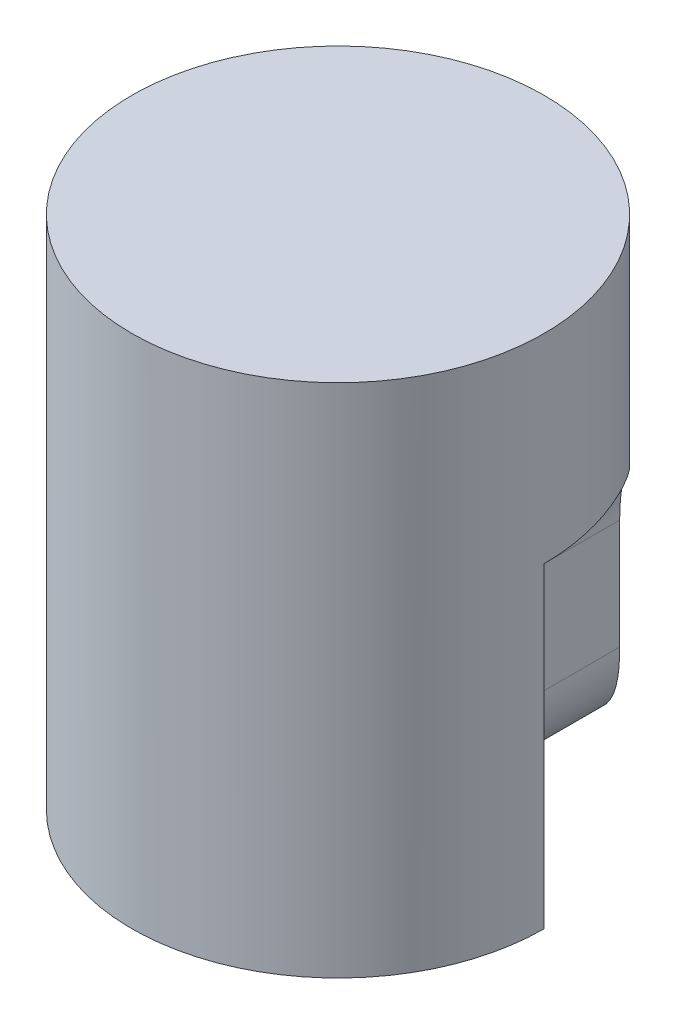
ISO-10303-21;
HEADER;
FILE_DESCRIPTION(('STEP AP214'),'2;1');
FILE_NAME('part.step','',(''),(''),'','','');
FILE_SCHEMA(('AUTOMOTIVE_DESIGN { 1 0 10303 214 1 1 1 1 }'));
ENDSEC;
DATA;
#1=APPLICATION_CONTEXT('core data for automotive mechanical design processes');
#2=APPLICATION_PROTOCOL_DEFINITION('international standard','automotive_design',2000,#1);
#3=PRODUCT_CONTEXT('',#1,'mechanical');
#4=PRODUCT('Part','Part','',(#3));
#5=PRODUCT_RELATED_PRODUCT_CATEGORY('part','',(#4));
#6=PRODUCT_DEFINITION_FORMATION('','',#4);
#7=PRODUCT_DEFINITION_CONTEXT('part definition',#1,'design');
#8=PRODUCT_DEFINITION('design','',#6,#7);
#9=PRODUCT_DEFINITION_SHAPE('','',#8);
#10=(LENGTH_UNIT() NAMED_UNIT(*) SI_UNIT(.MILLI.,.METRE.));
#11=(NAMED_UNIT(*) PLANE_ANGLE_UNIT() SI_UNIT($,.RADIAN.));
#12=(NAMED_UNIT(*) SI_UNIT($,.STERADIAN.) SOLID_ANGLE_UNIT());
#13=UNCERTAINTY_MEASURE_WITH_UNIT(LENGTH_MEASURE(1.E-05),#10,'distance_accuracy_value','');
#14=(GEOMETRIC_REPRESENTATION_CONTEXT(3) GLOBAL_UNCERTAINTY_ASSIGNED_CONTEXT((#13)) GLOBAL_UNIT_ASSIGNED_CONTEXT((#10,
#11,#12)) REPRESENTATION_CONTEXT('',''));
#15=CARTESIAN_POINT('',(0.,0.,0.));
#16=DIRECTION('',(0.,0.,1.));
#17=DIRECTION('',(1.,0.,0.));
#18=AXIS2_PLACEMENT_3D('',#15,#16,#17);
#19=CARTESIAN_POINT('',(-19.05,19.685,-19.05));
#20=DIRECTION('',(0.,0.,1.));
#21=DIRECTION('',(1.,0.,0.));
#22=AXIS2_PLACEMENT_3D('',#19,#20,#21);
#23=CYLINDRICAL_SURFACE('',#22,9.525);
#24=CARTESIAN_POINT('',(-9.525,19.685,-16.4977839420936));
#25=CARTESIAN_POINT('',(-9.52496088221768,19.9183489225181,-16.4977688060201));
#26=CARTESIAN_POINT('',(-9.53357343537535,20.1516940752239,-16.4928328837783));
#27=CARTESIAN_POINT('',(-9.56782098455367,20.6166928659615,-16.4730090010301));
#28=CARTESIAN_POINT('',(-9.59345495367734,20.8483466051835,-16.4581216408907));
#29=CARTESIAN_POINT('',(-9.66141827916372,21.3079945595453,-16.4183115148276));
#30=CARTESIAN_POINT('',(-9.70372489570546,21.5359933207643,-16.3934024165871));
#31=CARTESIAN_POINT('',(-9.80447603838081,21.9870185373,-16.3333465257956));
#32=CARTESIAN_POINT('',(-9.86292032641455,22.2100450659259,-16.2981998842917));
#33=CARTESIAN_POINT('',(-9.99521610639255,22.6496647273588,-16.2174027920262));
#34=CARTESIAN_POINT('',(-10.0690759660033,22.8662542928987,-16.1717466352449));
#35=CARTESIAN_POINT('',(-10.2311844392112,23.2913646090355,-16.0696774570777));
#36=CARTESIAN_POINT('',(-10.3194332274116,23.4998852616819,-16.0132643051592));
#37=CARTESIAN_POINT('',(-10.5090614848233,23.907378271473,-15.889459842336));
#38=CARTESIAN_POINT('',(-10.610436090431,24.1063541280786,-15.8220725953698));
#39=CARTESIAN_POINT('',(-10.8249112557721,24.4935890964673,-15.6761159898764));
#40=CARTESIAN_POINT('',(-10.9380117932454,24.6818482285936,-15.5975466525768));
#41=CARTESIAN_POINT('',(-11.1750045786399,25.0476332269237,-15.428644017613));
#42=CARTESIAN_POINT('',(-11.2989547084654,25.225091737611,-15.3382461680053));
#43=CARTESIAN_POINT('',(-11.5553100388477,25.5672572592252,-15.146054428585));
#44=CARTESIAN_POINT('',(-11.6877152197723,25.7319642997583,-15.0442605652328));
#45=CARTESIAN_POINT('',(-11.959148929316,26.0480866299765,-14.8294036879515));
#46=CARTESIAN_POINT('',(-12.0981788316448,26.1994991442271,-14.7163383313975));
#47=CARTESIAN_POINT('',(-12.3809673411905,26.4887154893166,-14.4792332961164));
#48=CARTESIAN_POINT('',(-12.5247264570661,26.6265178498703,-14.3551924344594));
#49=CARTESIAN_POINT('',(-12.8240837443095,26.8965667697806,-14.08857600897));
#50=CARTESIAN_POINT('',(-12.9798652873072,27.0279466150489,-13.9453291609657));
#51=CARTESIAN_POINT('',(-13.292596777246,27.2756345492098,-13.6475637114415));
#52=CARTESIAN_POINT('',(-13.4495467455553,27.3919423617454,-13.4930449033231));
#53=CARTESIAN_POINT('',(-13.762754527445,27.6100925803929,-13.1734257935092));
#54=CARTESIAN_POINT('',(-13.9190122351257,27.7119328426242,-13.0083239288083));
#55=CARTESIAN_POINT('',(-14.2291689687109,27.9019522424798,-12.6683171080798));
#56=CARTESIAN_POINT('',(-14.3830675205959,27.9901286662581,-12.4934102139944));
#57=CARTESIAN_POINT('',(-14.7634019767403,28.1948738825906,-12.0444610740112));
#58=CARTESIAN_POINT('',(-14.9874622880082,28.3034702163249,-11.7647359891822));
#59=CARTESIAN_POINT('',(-15.4231140025516,28.4956795942884,-11.1875373147456));
#60=CARTESIAN_POINT('',(-15.6347002190687,28.5792823041117,-10.8900564442661));
#61=CARTESIAN_POINT('',(-16.0430181059987,28.7255106526052,-10.2790758596334));
#62=CARTESIAN_POINT('',(-16.2397117705415,28.7880839352012,-9.96553837162547));
#63=CARTESIAN_POINT('',(-16.6156059306471,28.8957307298342,-9.32534286156705));
#64=CARTESIAN_POINT('',(-16.7948065222032,28.9408043379049,-8.99868491152914));
#65=CARTESIAN_POINT('',(-17.1919107043764,29.0299199555339,-8.2213326110348));
#66=CARTESIAN_POINT('',(-17.4023168073958,29.068423234301,-7.76615790744586));
#67=CARTESIAN_POINT('',(-17.7869232765458,29.1278875229511,-6.83957324511065));
#68=CARTESIAN_POINT('',(-17.9611090507862,29.1488414730828,-6.36815683196184));
#69=CARTESIAN_POINT('',(-18.2716936861273,29.1794304518547,-5.41292995545997));
#70=CARTESIAN_POINT('',(-18.4081089023756,29.1890703854879,-4.92912495598502));
#71=CARTESIAN_POINT('',(-18.6422412025836,29.201989918901,-3.95240402807187));
#72=CARTESIAN_POINT('',(-18.7399742848313,29.2052721503127,-3.45949195463885));
#73=CARTESIAN_POINT('',(-18.8953354589647,29.2090593684037,-2.47291842915605));
#74=CARTESIAN_POINT('',(-18.9533953562265,29.209594684118,-1.97932562121706));
#75=CARTESIAN_POINT('',(-19.0113808096327,29.2099382589662,-1.23744501792455));
#76=CARTESIAN_POINT('',(-19.0258585637053,29.2099764580419,-0.990216330272583));
#77=CARTESIAN_POINT('',(-19.0451690165321,29.2100015099948,-0.49533373001284));
#78=CARTESIAN_POINT('',(-19.0499998133406,29.2099883527484,-0.247679743186022));
#79=CARTESIAN_POINT('',(-19.05,29.21,0.));
#80=B_SPLINE_CURVE_WITH_KNOTS('',3,(#24,#25,#26,#27,#28,#29,#30,#31,#32,#33,#34,#35,#36,#37,#38,
#39,#40,#41,#42,#43,#44,#45,#46,#47,#48,#49,#50,#51,#52,#53,#54,#55,#56,#57,#58,#59,#60,#61,#62,
#63,#64,#65,#66,#67,#68,#69,#70,#71,#72,#73,#74,#75,#76,#77,#78,#79),.UNSPECIFIED.,.F.,.F.,(4,2,
2,2,2,2,2,2,2,2,2,2,2,2,2,2,2,2,2,2,2,2,2,2,2,2,2,4),(0.,0.699830412948111,1.39961860917055,
2.09845564936072,2.79728237925847,3.49648942772335,4.19570496138007,4.89466214716575,
5.59361800609943,6.29656113471492,6.99950263119766,7.70259053020982,8.40575429989958,
9.15228216119596,9.89882370870057,10.6454757676643,11.39227593352,12.514027104908,
13.6362414603873,14.7612293986247,15.886211163132,17.3928861920892,18.90016703619,
20.4067941835203,21.9127975621273,23.4021366350037,24.1449308829149,24.8878715619513),.UNSPECIFIED.);
#81=CARTESIAN_POINT('',(-17.9391332213087,29.145,-6.41014814712887));
#82=VERTEX_POINT('',#81);
#83=CARTESIAN_POINT('',(-19.05,29.21,0.));
#84=VERTEX_POINT('',#83);
#85=EDGE_CURVE('E269',#82,#84,#80,.T.);
#86=ORIENTED_EDGE('',*,*,#85,.F.);
#87=DIRECTION('',(0.,0.,1.));
#88=VECTOR('',#87,1.);
#89=CARTESIAN_POINT('',(-17.9391332213087,29.145,-19.05));
#90=LINE('',#89,#88);
#91=CARTESIAN_POINT('',(-17.9391332213087,29.145,0.));
#92=VERTEX_POINT('',#91);
#93=EDGE_CURVE('E180',#82,#92,#90,.T.);
#94=ORIENTED_EDGE('',*,*,#93,.T.);
#95=CARTESIAN_POINT('',(-19.05,19.685,0.));
#96=DIRECTION('',(0.,0.,1.));
#97=DIRECTION('',(1.,0.,0.));
#98=AXIS2_PLACEMENT_3D('',#95,#96,#97);
#99=CIRCLE('',#98,9.525);
#100=EDGE_CURVE('E211',#92,#84,#99,.T.);
#101=ORIENTED_EDGE('',*,*,#100,.T.);
#102=EDGE_LOOP('',(#86,#94,#101));
#103=FACE_BOUND('',#102,.T.);
#104=ADVANCED_FACE('F39',(#103),#23,.F.);
#105=CARTESIAN_POINT('',(0.,47.625,0.));
#106=DIRECTION('',(0.,-1.,0.));
#107=DIRECTION('',(0.,0.,-1.));
#108=AXIS2_PLACEMENT_3D('',#105,#106,#107);
#109=CYLINDRICAL_SURFACE('',#108,19.05);
#110=CARTESIAN_POINT('',(0.,14.2875,-19.05));
#111=CARTESIAN_POINT('',(-0.263131581526396,14.2874926157813,-19.0499955508094));
#112=CARTESIAN_POINT('',(-0.526345651112674,14.2656193262932,-19.0444938556855));
#113=CARTESIAN_POINT('',(-1.04523007797144,14.1788351446003,-19.0230796140991));
#114=CARTESIAN_POINT('',(-1.3008960738146,14.1138998597173,-19.0071611670842));
#115=CARTESIAN_POINT('',(-1.79711626917968,13.9432053702579,-18.966676136042));
#116=CARTESIAN_POINT('',(-2.03768821389026,13.837495189079,-18.9421199402354));
#117=CARTESIAN_POINT('',(-2.49768401879656,13.5884240866076,-18.886974665892));
#118=CARTESIAN_POINT('',(-2.71710716530732,13.4450618953223,-18.8563853838695));
#119=CARTESIAN_POINT('',(-3.13309611918041,13.121637492848,-18.7917903815363));
#120=CARTESIAN_POINT('',(-3.32916431594386,12.940945749505,-18.757731951953));
#121=CARTESIAN_POINT('',(-3.68855284387054,12.5493392494138,-18.6903874387445));
#122=CARTESIAN_POINT('',(-3.85186947731368,12.3384210846435,-18.6571014427033));
#123=CARTESIAN_POINT('',(-4.14345927338674,11.8884851551101,-18.5945391284168));
#124=CARTESIAN_POINT('',(-4.27117578556232,11.6490964921823,-18.5653297242578));
#125=CARTESIAN_POINT('',(-4.48436018464861,11.1513987929794,-18.514996460472));
#126=CARTESIAN_POINT('',(-4.56983482602245,10.8930927891709,-18.4938713082978));
#127=CARTESIAN_POINT('',(-4.69441160685513,10.3703643932097,-18.4626401351082));
#128=CARTESIAN_POINT('',(-4.73440845195427,10.1061682050794,-18.4523218391551));
#129=CARTESIAN_POINT('',(-4.76968113583585,9.57462979342708,-18.443237258092));
#130=CARTESIAN_POINT('',(-4.7649642502725,9.30728808880247,-18.4444690935867));
#131=CARTESIAN_POINT('',(-4.71165721573106,8.7839048104085,-18.4581547751589));
#132=CARTESIAN_POINT('',(-4.66413323010526,8.52774640184758,-18.4703359004816));
#133=CARTESIAN_POINT('',(-4.528261793417,8.02715866335739,-18.5041130320564));
#134=CARTESIAN_POINT('',(-4.43991143407032,7.78273017038318,-18.5257097090233));
#135=CARTESIAN_POINT('',(-4.22398659245056,7.30968179839949,-18.5761348665047));
#136=CARTESIAN_POINT('',(-4.09602516846452,7.08124640456812,-18.6050341471667));
#137=CARTESIAN_POINT('',(-3.80478117634745,6.6487080965221,-18.6667683193602));
#138=CARTESIAN_POINT('',(-3.64149242746806,6.44460944988648,-18.6996038991244));
#139=CARTESIAN_POINT('',(-3.27870637336287,6.06042852017027,-18.7666592071416));
#140=CARTESIAN_POINT('',(-3.07830936967661,5.88119699405521,-18.8008917059265));
#141=CARTESIAN_POINT('',(-2.64989283807425,5.55872255517711,-18.8660394071255));
#142=CARTESIAN_POINT('',(-2.42187246672272,5.41548074171318,-18.8969545081937));
#143=CARTESIAN_POINT('',(-1.94346794656342,5.16873938873758,-18.9521379939905));
#144=CARTESIAN_POINT('',(-1.69300967343738,5.06537804469219,-18.9763831840553));
#145=CARTESIAN_POINT('',(-1.17753132585365,4.90246255437211,-19.0153263644775));
#146=CARTESIAN_POINT('',(-0.91251404730279,4.84290002837241,-19.0300261810222));
#147=CARTESIAN_POINT('',(-0.382714405988337,4.77057222935069,-19.0479521018661));
#148=CARTESIAN_POINT('',(-0.118099585962569,4.75664839221092,-19.0514621988878));
#149=CARTESIAN_POINT('',(0.409679377494787,4.77281558152617,-19.0474220528589));
#150=CARTESIAN_POINT('',(0.67284364937159,4.80290264588726,-19.0398728054288));
#151=CARTESIAN_POINT('',(1.18622530336535,4.90528263414262,-19.0147442007934));
#152=CARTESIAN_POINT('',(1.43657675272578,4.97694351153939,-18.9973151353987));
#153=CARTESIAN_POINT('',(1.92169190353674,5.15971499179036,-18.9543914356345));
#154=CARTESIAN_POINT('',(2.15645402792867,5.27082957869448,-18.928895986747));
#155=CARTESIAN_POINT('',(2.60833595181471,5.5315997091771,-18.8719875266574));
#156=CARTESIAN_POINT('',(2.82506877782855,5.6819041568591,-18.8404775388889));
#157=CARTESIAN_POINT('',(3.23064699831751,6.01595796043099,-18.7751881667117));
#158=CARTESIAN_POINT('',(3.41948756974007,6.19971308828598,-18.7414083912834));
#159=CARTESIAN_POINT('',(3.76869505363012,6.60083122567881,-18.6743643834617));
#160=CARTESIAN_POINT('',(3.92824927969695,6.81890845702377,-18.6411331577848));
#161=CARTESIAN_POINT('',(4.20849665986832,7.27942611443756,-18.5798738886387));
#162=CARTESIAN_POINT('',(4.32919153896266,7.5218654584305,-18.5518456142307));
#163=CARTESIAN_POINT('',(4.5273957604281,8.02292566864045,-18.5044745072254));
#164=CARTESIAN_POINT('',(4.60516095934264,8.28144021989396,-18.4850803532866));
#165=CARTESIAN_POINT('',(4.71597247031956,8.80843310018815,-18.4571241228829));
#166=CARTESIAN_POINT('',(4.7490285622388,9.0769092369841,-18.4485596775091));
#167=CARTESIAN_POINT('',(4.76897252431611,9.60793425078059,-18.4434131133217));
#168=CARTESIAN_POINT('',(4.75715932544307,9.87043185658123,-18.4464938626329));
#169=CARTESIAN_POINT('',(4.69067285863095,10.3895648465644,-18.4635111092241));
#170=CARTESIAN_POINT('',(4.63600045202906,10.6462003484503,-18.4774473883417));
#171=CARTESIAN_POINT('',(4.48605693923536,11.1449118575155,-18.5144175271476));
#172=CARTESIAN_POINT('',(4.3910294598614,11.3870654441331,-18.5373967338792));
#173=CARTESIAN_POINT('',(4.1632661006949,11.8521650901206,-18.5898712441369));
#174=CARTESIAN_POINT('',(4.03052499085822,12.0751084798697,-18.6193674513003));
#175=CARTESIAN_POINT('',(3.72703010192324,12.5017359470801,-18.6825138879017));
#176=CARTESIAN_POINT('',(3.5553750422465,12.7047659081207,-18.7162524084177));
#177=CARTESIAN_POINT('',(3.18068125352732,13.0795618672258,-18.7835548650601));
#178=CARTESIAN_POINT('',(2.97763508250411,13.2513204306088,-18.8171187578316));
#179=CARTESIAN_POINT('',(2.54148458778075,13.5617309046925,-18.8810155668159));
#180=CARTESIAN_POINT('',(2.30790249085454,13.6997268984072,-18.911278959367));
#181=CARTESIAN_POINT('',(1.82011973894576,13.9342731948362,-18.9644313679593));
#182=CARTESIAN_POINT('',(1.56593401391165,14.0308531950591,-18.9873256650929));
#183=CARTESIAN_POINT('',(1.09350255404803,14.1654905612966,-19.0197758912061));
#184=CARTESIAN_POINT('',(0.87750704263312,14.2111451966947,-19.031032075423));
#185=CARTESIAN_POINT('',(0.441026777127701,14.2721518709997,-19.0461457161143));
#186=CARTESIAN_POINT('',(0.220542361945307,14.2875061890443,-19.0500037290659));
#187=CARTESIAN_POINT('',(0.,14.2875,-19.05));
#188=B_SPLINE_CURVE_WITH_KNOTS('',3,(#110,#111,#112,#113,#114,#115,#116,#117,#118,#119,#120,
#121,#122,#123,#124,#125,#126,#127,#128,#129,#130,#131,#132,#133,#134,#135,#136,#137,#138,#139,
#140,#141,#142,#143,#144,#145,#146,#147,#148,#149,#150,#151,#152,#153,#154,#155,#156,#157,#158,
#159,#160,#161,#162,#163,#164,#165,#166,#167,#168,#169,#170,#171,#172,#173,#174,#175,#176,#177,
#178,#179,#180,#181,#182,#183,#184,#185,#186,#187),.UNSPECIFIED.,.T.,.F.,(4,2,2,2,2,2,2,2,2,2,2,
2,2,2,2,2,2,2,2,2,2,2,2,2,2,2,2,2,2,2,2,2,2,2,2,2,2,2,4),(0.,0.78858653709825,1.57762015490038,
2.36570806475839,3.15382256003762,3.95650832512916,4.75928466416696,5.57398705957937,
6.38855914212745,7.18681236945897,7.98493571018356,8.76371428007825,9.54254833515215,
10.3292442601011,11.1160779341536,11.9253476558718,12.7346420935798,13.5467162711448,
14.3586350397198,15.1497763092449,15.940846360435,16.7201937159261,17.4996197925881,
18.2928764053053,19.08627002561,19.8991381673475,20.7119702204023,21.51990408414,
22.3276611884506,23.1122150278763,23.8967531006066,24.6766207180149,25.4565965385991,
26.2569190512671,27.0574315904632,27.8724418898644,28.6868668015803,29.3478662136657,
30.008815904619),.UNSPECIFIED.);
#189=CARTESIAN_POINT('',(0.,14.2875,-19.05));
#190=VERTEX_POINT('',#189);
#191=EDGE_CURVE('E163',#190,#190,#188,.T.);
#192=ORIENTED_EDGE('',*,*,#191,.T.);
#193=EDGE_LOOP('',(#192));
#194=FACE_BOUND('',#193,.T.);
#195=CARTESIAN_POINT('',(0.,47.625,0.));
#196=DIRECTION('',(0.,1.,0.));
#197=DIRECTION('',(0.,0.,1.));
#198=AXIS2_PLACEMENT_3D('',#195,#196,#197);
#199=CIRCLE('',#198,19.05);
#200=CARTESIAN_POINT('',(0.,47.625,19.05));
#201=VERTEX_POINT('',#200);
#202=EDGE_CURVE('E232',#201,#201,#199,.T.);
#203=ORIENTED_EDGE('',*,*,#202,.F.);
#204=EDGE_LOOP('',(#203));
#205=FACE_BOUND('',#204,.T.);
#206=CARTESIAN_POINT('',(0.,29.145,0.));
#207=DIRECTION('',(0.,1.,0.));
#208=DIRECTION('',(0.,0.,1.));
#209=AXIS2_PLACEMENT_3D('',#206,#207,#208);
#210=CIRCLE('',#209,19.05);
#211=CARTESIAN_POINT('',(-19.05,29.145,0.));
#212=VERTEX_POINT('',#211);
#213=CARTESIAN_POINT('',(-16.1144934763709,29.145,10.16));
#214=VERTEX_POINT('',#213);
#215=EDGE_CURVE('E65',#212,#214,#210,.T.);
#216=ORIENTED_EDGE('',*,*,#215,.T.);
#217=DIRECTION('',(0.,-1.,0.));
#218=VECTOR('',#217,1.);
#219=CARTESIAN_POINT('',(-16.1144934763709,47.625,10.16));
#220=LINE('',#219,#218);
#221=CARTESIAN_POINT('',(-16.1144934763709,0.,10.16));
#222=VERTEX_POINT('',#221);
#223=EDGE_CURVE('E192',#214,#222,#220,.T.);
#224=ORIENTED_EDGE('',*,*,#223,.T.);
#225=CARTESIAN_POINT('',(0.,0.,0.));
#226=DIRECTION('',(0.,1.,0.));
#227=DIRECTION('',(0.,0.,1.));
#228=AXIS2_PLACEMENT_3D('',#225,#226,#227);
#229=CIRCLE('',#228,19.05);
#230=CARTESIAN_POINT('',(19.05,0.,0.));
#231=VERTEX_POINT('',#230);
#232=EDGE_CURVE('E234',#222,#231,#229,.T.);
#233=ORIENTED_EDGE('',*,*,#232,.T.);
#234=DIRECTION('',(0.,1.,0.));
#235=VECTOR('',#234,1.);
#236=CARTESIAN_POINT('',(19.05,-1.366,0.));
#237=LINE('',#236,#235);
#238=CARTESIAN_POINT('',(19.05,29.21,0.));
#239=VERTEX_POINT('',#238);
#240=EDGE_CURVE('E200',#231,#239,#237,.T.);
#241=ORIENTED_EDGE('',*,*,#240,.T.);
#242=CARTESIAN_POINT('',(19.05,29.21,0.));
#243=CARTESIAN_POINT('',(19.0500031423625,29.2099793158079,-0.266319267713953));
#244=CARTESIAN_POINT('',(19.0444152804942,29.2099994611175,-0.532636111404346));
#245=CARTESIAN_POINT('',(19.0220816882376,29.2099710782212,-1.06480200302641));
#246=CARTESIAN_POINT('',(19.0053359391149,29.2099225499002,-1.33065105017189));
#247=CARTESIAN_POINT('',(18.9607027480369,29.2096064298755,-1.86151223113813));
#248=CARTESIAN_POINT('',(18.9328113312285,29.2093387599842,-2.12652403235371));
#249=CARTESIAN_POINT('',(18.8659429637877,29.208279228249,-2.65512565628479));
#250=CARTESIAN_POINT('',(18.826966044504,29.2074873678874,-2.91871548301934));
#251=CARTESIAN_POINT('',(18.6929770588812,29.2037377959692,-3.70973281370498));
#252=CARTESIAN_POINT('',(18.581158321484,29.1993996438799,-4.23441175651461));
#253=CARTESIAN_POINT('',(18.3137533312449,29.1824456662411,-5.27219090432968));
#254=CARTESIAN_POINT('',(18.1581791971509,29.169832131402,-5.78529427292759));
#255=CARTESIAN_POINT('',(17.8379125076404,29.133662897117,-6.70075992239465));
#256=CARTESIAN_POINT('',(17.6804671833627,29.1126181010311,-7.10576455913997));
#257=CARTESIAN_POINT('',(17.3386312566981,29.0565985204871,-7.90332416880696));
#258=CARTESIAN_POINT('',(17.1542402845231,29.0216235448469,-8.29587897078352));
#259=CARTESIAN_POINT('',(16.7606596540479,28.9329786268124,-9.06469601693217));
#260=CARTESIAN_POINT('',(16.5515475338079,28.8793661656446,-9.4410044017695));
#261=CARTESIAN_POINT('',(16.1103899111492,28.7479604657312,-10.1755152311398));
#262=CARTESIAN_POINT('',(15.878352893697,28.6701761507772,-10.5337243009512));
#263=CARTESIAN_POINT('',(15.4635323640473,28.5109391646804,-11.1298527951504));
#264=CARTESIAN_POINT('',(15.2854809081633,28.436804903698,-11.3730378563674));
#265=CARTESIAN_POINT('',(14.9211876864376,28.2709521411411,-11.8469357107622));
#266=CARTESIAN_POINT('',(14.7349480087414,28.1792381029145,-12.0776516507182));
#267=CARTESIAN_POINT('',(14.3566570232797,27.9762115529755,-12.5249603388487));
#268=CARTESIAN_POINT('',(14.1646108176963,27.8649158556334,-12.7415649871816));
#269=CARTESIAN_POINT('',(13.7773658557318,27.6208237218171,-13.1593218625055));
#270=CARTESIAN_POINT('',(13.5821676242865,27.4880308328915,-13.3604766310327));
#271=CARTESIAN_POINT('',(13.2244587634061,27.2235414238597,-13.7138070687217));
#272=CARTESIAN_POINT('',(13.0619119884757,27.0953370083323,-13.8685640756173));
#273=CARTESIAN_POINT('',(12.7392042765104,26.8225136538933,-14.1655651153781));
#274=CARTESIAN_POINT('',(12.5790428754823,26.6778979556844,-14.3078116088559));
#275=CARTESIAN_POINT('',(12.2635021647983,26.3721016054898,-14.5791743176606));
#276=CARTESIAN_POINT('',(12.1081222370277,26.2109231064135,-14.7082922351707));
#277=CARTESIAN_POINT('',(11.8046225240808,25.872231057236,-14.9529727074532));
#278=CARTESIAN_POINT('',(11.656502835603,25.6947172896579,-15.0685350817093));
#279=CARTESIAN_POINT('',(11.3693895159656,25.3231915201881,-15.2863373805226));
#280=CARTESIAN_POINT('',(11.230439737627,25.1291091757352,-15.3885153076288));
#281=CARTESIAN_POINT('',(10.964826940015,24.7262118944501,-15.5788891221235));
#282=CARTESIAN_POINT('',(10.8381642817918,24.5173965250073,-15.6670845986934));
#283=CARTESIAN_POINT('',(10.5993058379913,24.0863783263824,-15.8296592787907));
#284=CARTESIAN_POINT('',(10.487117084096,23.8641690665461,-15.9040317745394));
#285=CARTESIAN_POINT('',(10.2792478139679,23.4082099521896,-16.0391692067522));
#286=CARTESIAN_POINT('',(10.1835654697823,23.174461379248,-16.0999356502));
#287=CARTESIAN_POINT('',(10.0175858531755,22.7173607084186,-16.2036796029616));
#288=CARTESIAN_POINT('',(9.94583426399626,22.4947757106972,-16.24772025966));
#289=CARTESIAN_POINT('',(9.81855225442402,22.0431811636815,-16.3249527281687));
#290=CARTESIAN_POINT('',(9.76302096730887,21.814171958378,-16.3581451196608));
#291=CARTESIAN_POINT('',(9.66902743600899,21.3518895972506,-16.4138779313956));
#292=CARTESIAN_POINT('',(9.63053204886234,21.1186256482057,-16.4364390401545));
#293=CARTESIAN_POINT('',(9.57098044062086,20.649221275654,-16.4711880105793));
#294=CARTESIAN_POINT('',(9.54991350563648,20.4130827100169,-16.4833822452591));
#295=CARTESIAN_POINT('',(9.53345537960647,20.0945553962913,-16.4928996548008));
#296=CARTESIAN_POINT('',(9.53028313867884,20.0126327665687,-16.4947327063678));
#297=CARTESIAN_POINT('',(9.52605691472012,19.8488098651631,-16.4971739342479));
#298=CARTESIAN_POINT('',(9.52500047597256,19.766909678003,-16.4977835305723));
#299=CARTESIAN_POINT('',(9.525,19.685,-16.4977839420936));
#300=B_SPLINE_CURVE_WITH_KNOTS('',3,(#242,#243,#244,#245,#246,#247,#248,#249,#250,#251,#252,
#253,#254,#255,#256,#257,#258,#259,#260,#261,#262,#263,#264,#265,#266,#267,#268,#269,#270,#271,
#272,#273,#274,#275,#276,#277,#278,#279,#280,#281,#282,#283,#284,#285,#286,#287,#288,#289,#290,
#291,#292,#293,#294,#295,#296,#297,#298,#299),.UNSPECIFIED.,.F.,.F.,(4,2,2,2,2,2,2,2,2,2,2,2,2,
2,2,2,2,2,2,2,2,2,2,2,2,2,2,2,4),(0.,0.79889447907806,1.5977902995246,2.39697128291902,
3.19615000633318,4.80349956064718,6.41040437178401,7.71439554079129,9.01840460678187,
10.3184270506312,11.6179701198004,12.5483662331231,13.4785264393491,14.4078917997747,
15.3371039488346,16.1117460161097,16.8862353816937,17.6606242026084,18.4350233347229,
19.2128914240023,19.9907823635955,20.769049804764,21.5472310036427,22.2602861531013,
22.9733031939092,23.6849269115434,24.3961128430135,24.6420994894573,24.8878004644176),.UNSPECIFIED.);
#301=CARTESIAN_POINT('',(9.525,19.685,-16.4977839420936));
#302=VERTEX_POINT('',#301);
#303=EDGE_CURVE('E254',#239,#302,#300,.T.);
#304=ORIENTED_EDGE('',*,*,#303,.T.);
#305=DIRECTION('',(0.,-1.,0.));
#306=VECTOR('',#305,1.);
#307=CARTESIAN_POINT('',(9.525,47.625,-16.4977839420936));
#308=LINE('',#307,#306);
#309=CARTESIAN_POINT('',(9.525,9.525,-16.4977839420936));
#310=VERTEX_POINT('',#309);
#311=EDGE_CURVE('E263',#302,#310,#308,.T.);
#312=ORIENTED_EDGE('',*,*,#311,.T.);
#313=CARTESIAN_POINT('',(9.525,9.525,-16.4977839420936));
#314=CARTESIAN_POINT('',(9.52500093747954,9.40027209421962,-16.4977810735741));
#315=CARTESIAN_POINT('',(9.52254953784947,9.27556178511107,-16.4991989995034));
#316=CARTESIAN_POINT('',(9.51275823608709,9.02640215193021,-16.5048470851032));
#317=CARTESIAN_POINT('',(9.50541854029967,8.90195281706406,-16.5090771260686));
#318=CARTESIAN_POINT('',(9.47610755613453,8.52953008785314,-16.5259320263721));
#319=CARTESIAN_POINT('',(9.44684431094398,8.28226939179681,-16.5427217617591));
#320=CARTESIAN_POINT('',(9.36949042306317,7.79316361058348,-16.5866541376331));
#321=CARTESIAN_POINT('',(9.32150879811789,7.55129558857391,-16.6137368078868));
#322=CARTESIAN_POINT('',(9.20730508646458,7.07314726762764,-16.6772988645716));
#323=CARTESIAN_POINT('',(9.14108090496344,6.83686761378886,-16.7137793301204));
#324=CARTESIAN_POINT('',(8.99129458512088,6.37194591145842,-16.7948308944192));
#325=CARTESIAN_POINT('',(8.90777410802718,6.14328701580969,-16.8393825206213));
#326=CARTESIAN_POINT('',(8.72407445835317,5.69419496551738,-16.9352812990502));
#327=CARTESIAN_POINT('',(8.62388892927856,5.47376498903525,-16.9866310427286));
#328=CARTESIAN_POINT('',(8.29930031998922,4.82600833094281,-17.1488397555145));
#329=CARTESIAN_POINT('',(8.05094911141999,4.41247255811889,-17.2678106328938));
#330=CARTESIAN_POINT('',(7.47385251425767,3.59739239755659,-17.5257389268));
#331=CARTESIAN_POINT('',(7.14019517554531,3.19959093586943,-17.6655351459832));
#332=CARTESIAN_POINT('',(6.59462548960891,2.64723336796196,-17.873206104711));
#333=CARTESIAN_POINT('',(6.40513840135444,2.47041996984907,-17.9421298594271));
#334=CARTESIAN_POINT('',(6.01183560711684,2.13239149875179,-18.0777085141383));
#335=CARTESIAN_POINT('',(5.80801788115306,1.97117863238748,-18.1443630923074));
#336=CARTESIAN_POINT('',(5.37270663542971,1.655001635067,-18.2781797255691));
#337=CARTESIAN_POINT('',(5.14027362851396,1.50121275664804,-18.3450665924189));
#338=CARTESIAN_POINT('',(4.6616166019349,1.21399468461606,-18.4724964439603));
#339=CARTESIAN_POINT('',(4.41539832619188,1.08055709626132,-18.5330420411279));
#340=CARTESIAN_POINT('',(3.91085391258738,0.835382564492047,-18.646031692686));
#341=CARTESIAN_POINT('',(3.65253806951477,0.723627571679248,-18.6984824779932));
#342=CARTESIAN_POINT('',(3.12549123400423,0.522978965692613,-18.7937609703846));
#343=CARTESIAN_POINT('',(2.85676300617477,0.434079331374818,-18.8365912115827));
#344=CARTESIAN_POINT('',(2.37518449988714,0.298343355478255,-18.9025247915449));
#345=CARTESIAN_POINT('',(2.16403192273441,0.246531670598502,-18.9278987170506));
#346=CARTESIAN_POINT('',(1.73799792590643,0.157378576729821,-18.9717604247746));
#347=CARTESIAN_POINT('',(1.52311697113068,0.120035376990227,-18.9902490591678));
#348=CARTESIAN_POINT('',(1.09081024704751,0.0601505142748032,-19.0199783079252));
#349=CARTESIAN_POINT('',(0.873384560151698,0.0376083733066879,-19.0312191563526));
#350=CARTESIAN_POINT('',(0.437310157487209,0.0075348958899406,-19.0462292791306));
#351=CARTESIAN_POINT('',(0.218661825767295,-9.1485758262935E-07,-19.0500007805456));
#352=CARTESIAN_POINT('',(-0.250694133400216,1.04887731572296E-06,-19.0499991051104));
#353=CARTESIAN_POINT('',(-0.501406003982853,0.00990870865802112,-19.0450397532517));
#354=CARTESIAN_POINT('',(-1.00089450799447,0.0494200769171938,-19.0253305256848));
#355=CARTESIAN_POINT('',(-1.24967095927905,0.0790256170319584,-19.0105797395061));
#356=CARTESIAN_POINT('',(-1.74352182056423,0.157593585943663,-18.9716634415976));
#357=CARTESIAN_POINT('',(-1.98859433740116,0.206565587662074,-18.9474932739149));
#358=CARTESIAN_POINT('',(-2.4731576523645,0.323302955414961,-18.8903550949035));
#359=CARTESIAN_POINT('',(-2.71264852602442,0.391068066971633,-18.8573872027053));
#360=CARTESIAN_POINT('',(-3.18367027847153,0.544409437397825,-18.7835934589554));
#361=CARTESIAN_POINT('',(-3.41522564124831,0.629923810273245,-18.7427949465242));
#362=CARTESIAN_POINT('',(-3.86986980808144,0.818090952424428,-18.6542287892533));
#363=CARTESIAN_POINT('',(-4.09295860455704,0.920743737045045,-18.6064611381738));
#364=CARTESIAN_POINT('',(-4.52947545307478,1.14231625241896,-18.5050415387934));
#365=CARTESIAN_POINT('',(-4.7429042343687,1.26123475250922,-18.4513900357252));
#366=CARTESIAN_POINT('',(-5.15918821390778,1.51451979155196,-18.3393501737336));
#367=CARTESIAN_POINT('',(-5.36203919590498,1.64889242304794,-18.2809599493339));
#368=CARTESIAN_POINT('',(-5.76805465251906,1.94071548747892,-18.1570856068683));
#369=CARTESIAN_POINT('',(-5.97050562191387,2.09906743918377,-18.0913860529879));
#370=CARTESIAN_POINT('',(-6.36152507185717,2.43116951285468,-17.9576225182624));
#371=CARTESIAN_POINT('',(-6.550092758189,2.60492051449833,-17.889558402476));
#372=CARTESIAN_POINT('',(-6.91261842927898,2.96702667675589,-17.7526273821361));
#373=CARTESIAN_POINT('',(-7.08656573885965,3.15539231865449,-17.6837599320927));
#374=CARTESIAN_POINT('',(-7.41889527133036,3.54575749658731,-17.5469312460055));
#375=CARTESIAN_POINT('',(-7.57727453769163,3.74775961008614,-17.4789701842041));
#376=CARTESIAN_POINT('',(-7.88939700217332,4.18086557126665,-17.3404531069431));
#377=CARTESIAN_POINT('',(-8.04179770727943,4.41300888683323,-17.2701128895096));
#378=CARTESIAN_POINT('',(-8.32627771527753,4.89078123540524,-17.1347720392273));
#379=CARTESIAN_POINT('',(-8.45836573520054,5.13640442187939,-17.0697691215309));
#380=CARTESIAN_POINT('',(-8.70091298560948,5.63943979075979,-16.9474199715595));
#381=CARTESIAN_POINT('',(-8.81140698618902,5.8968321840107,-16.8900614786156));
#382=CARTESIAN_POINT('',(-9.0097862459633,6.42207787375194,-16.7850787849523));
#383=CARTESIAN_POINT('',(-9.09767796818414,6.68992815456406,-16.7374518023507));
#384=CARTESIAN_POINT('',(-9.23137202758865,7.16843952464304,-16.66399084475));
#385=CARTESIAN_POINT('',(-9.28221306600418,7.3773258191863,-16.635670983806));
#386=CARTESIAN_POINT('',(-9.36976215878759,7.79887498369569,-16.5865176895843));
#387=CARTESIAN_POINT('',(-9.40647369999817,8.01153690835198,-16.5656824093649));
#388=CARTESIAN_POINT('',(-9.46551135115802,8.44025591145847,-16.5320241688235));
#389=CARTESIAN_POINT('',(-9.48778591588073,8.65632236447173,-16.5192299227748));
#390=CARTESIAN_POINT('',(-9.51754790131781,9.08991896849036,-16.5020857117257));
#391=CARTESIAN_POINT('',(-9.52502732921984,9.30744984699227,-16.497740311087));
#392=CARTESIAN_POINT('',(-9.525,9.525,-16.4977839420936));
#393=B_SPLINE_CURVE_WITH_KNOTS('',3,(#313,#314,#315,#316,#317,#318,#319,#320,#321,#322,#323,
#324,#325,#326,#327,#328,#329,#330,#331,#332,#333,#334,#335,#336,#337,#338,#339,#340,#341,#342,
#343,#344,#345,#346,#347,#348,#349,#350,#351,#352,#353,#354,#355,#356,#357,#358,#359,#360,#361,
#362,#363,#364,#365,#366,#367,#368,#369,#370,#371,#372,#373,#374,#375,#376,#377,#378,#379,#380,
#381,#382,#383,#384,#385,#386,#387,#388,#389,#390,#391,#392),.UNSPECIFIED.,.F.,.F.,(4,2,2,2,2,2,
2,2,2,2,2,2,2,2,2,2,2,2,2,2,2,2,2,2,2,2,2,2,2,2,2,2,2,2,2,2,2,2,2,4),(0.,0.374116816034463,
0.748217840839559,1.49578451773961,2.23906077322034,2.98242241473223,3.72401393797388,
4.46588897531036,5.9504551477738,7.55636492671559,8.36020404664212,9.16415670005716,
10.0229175413191,10.8813231870438,11.7390111689546,12.5964729646525,13.2525713087983,
13.9085884223147,14.5645843490667,15.2203846542683,15.9722547560532,16.7241947813552,
17.4765069592218,18.2288089505144,18.9785306896761,19.7282531001037,20.4779188179245,
21.2278810991092,22.0229050928858,22.8179745320713,23.6136195433484,24.4094153649023,
25.2677509635848,26.1257171800781,26.9822903303719,27.8386182741526,28.4885666857731,
29.1383546017194,29.7904498986843,30.4428973825533),.UNSPECIFIED.);
#394=CARTESIAN_POINT('',(-9.525,9.525,-16.4977839420936));
#395=VERTEX_POINT('',#394);
#396=EDGE_CURVE('E217',#310,#395,#393,.T.);
#397=ORIENTED_EDGE('',*,*,#396,.T.);
#398=DIRECTION('',(0.,-1.,0.));
#399=VECTOR('',#398,1.);
#400=CARTESIAN_POINT('',(-9.525,47.625,-16.4977839420936));
#401=LINE('',#400,#399);
#402=CARTESIAN_POINT('',(-9.525,19.685,-16.4977839420936));
#403=VERTEX_POINT('',#402);
#404=EDGE_CURVE('E270',#395,#403,#401,.F.);
#405=ORIENTED_EDGE('',*,*,#404,.T.);
#406=CARTESIAN_POINT('',(-16.1144934763709,28.7463700095367,-10.16));
#407=VERTEX_POINT('',#406);
#408=EDGE_CURVE('E271',#403,#407,#80,.T.);
#409=ORIENTED_EDGE('',*,*,#408,.T.);
#410=DIRECTION('',(0.,-1.,0.));
#411=VECTOR('',#410,1.);
#412=CARTESIAN_POINT('',(-16.1144934763709,47.625,-10.16));
#413=LINE('',#412,#411);
#414=CARTESIAN_POINT('',(-16.1144934763709,29.145,-10.16));
#415=VERTEX_POINT('',#414);
#416=EDGE_CURVE('E188',#407,#415,#413,.F.);
#417=ORIENTED_EDGE('',*,*,#416,.T.);
#418=EDGE_CURVE('E181',#415,#82,#210,.T.);
#419=ORIENTED_EDGE('',*,*,#418,.T.);
#420=ORIENTED_EDGE('',*,*,#85,.T.);
#421=DIRECTION('',(0.,-1.,0.));
#422=VECTOR('',#421,1.);
#423=CARTESIAN_POINT('',(-19.05,29.21,0.));
#424=LINE('',#423,#422);
#425=EDGE_CURVE('E198',#84,#212,#424,.T.);
#426=ORIENTED_EDGE('',*,*,#425,.T.);
#427=EDGE_LOOP('',(#216,#224,#233,#241,#304,#312,#397,#405,#409,#417,#419,#420,#426));
#428=FACE_BOUND('',#427,.T.);
#429=ADVANCED_FACE('F41',(#194,#205,#428),#109,.T.);
#430=CARTESIAN_POINT('',(0.,47.625,0.));
#431=DIRECTION('',(0.,1.,0.));
#432=DIRECTION('',(0.,0.,1.));
#433=AXIS2_PLACEMENT_3D('',#430,#431,#432);
#434=PLANE('',#433);
#435=ORIENTED_EDGE('',*,*,#202,.T.);
#436=EDGE_LOOP('',(#435));
#437=FACE_BOUND('',#436,.T.);
#438=ADVANCED_FACE('F251',(#437),#434,.T.);
#439=CARTESIAN_POINT('',(0.,0.,0.));
#440=DIRECTION('',(0.,1.,0.));
#441=DIRECTION('',(0.,0.,1.));
#442=AXIS2_PLACEMENT_3D('',#439,#440,#441);
#443=PLANE('',#442);
#444=ORIENTED_EDGE('',*,*,#232,.F.);
#445=DIRECTION('',(1.,0.,0.));
#446=VECTOR('',#445,1.);
#447=CARTESIAN_POINT('',(0.,0.,10.16));
#448=LINE('',#447,#446);
#449=CARTESIAN_POINT('',(0.,0.,10.16));
#450=VERTEX_POINT('',#449);
#451=EDGE_CURVE('E143',#222,#450,#448,.T.);
#452=ORIENTED_EDGE('',*,*,#451,.T.);
#453=DIRECTION('',(0.,0.,-1.));
#454=VECTOR('',#453,1.);
#455=CARTESIAN_POINT('',(0.,0.,0.));
#456=LINE('',#455,#454);
#457=CARTESIAN_POINT('',(0.,0.,0.));
#458=VERTEX_POINT('',#457);
#459=EDGE_CURVE('E178',#450,#458,#456,.T.);
#460=ORIENTED_EDGE('',*,*,#459,.T.);
#461=DIRECTION('',(1.,0.,0.));
#462=VECTOR('',#461,1.);
#463=CARTESIAN_POINT('',(0.,0.,0.));
#464=LINE('',#463,#462);
#465=EDGE_CURVE('E262',#458,#231,#464,.T.);
#466=ORIENTED_EDGE('',*,*,#465,.T.);
#467=EDGE_LOOP('',(#444,#452,#460,#466));
#468=FACE_BOUND('',#467,.T.);
#469=ADVANCED_FACE('F281',(#468),#443,.F.);
#470=DIRECTION('',(0.,0.,1.));
#471=VECTOR('',#470,1.);
#472=CARTESIAN_POINT('',(-9.525,19.685,-19.05));
#473=LINE('',#472,#471);
#474=CARTESIAN_POINT('',(-9.525,19.685,-10.16));
#475=VERTEX_POINT('',#474);
#476=EDGE_CURVE('E214',#403,#475,#473,.T.);
#477=ORIENTED_EDGE('',*,*,#476,.T.);
#478=CARTESIAN_POINT('',(-19.05,19.685,-10.16));
#479=DIRECTION('',(0.,0.,-1.));
#480=DIRECTION('',(-1.,0.,0.));
#481=AXIS2_PLACEMENT_3D('',#478,#479,#480);
#482=CIRCLE('',#481,9.525);
#483=EDGE_CURVE('E190',#475,#407,#482,.F.);
#484=ORIENTED_EDGE('',*,*,#483,.T.);
#485=ORIENTED_EDGE('',*,*,#408,.F.);
#486=EDGE_LOOP('',(#477,#484,#485));
#487=FACE_BOUND('',#486,.T.);
#488=ADVANCED_FACE('F278',(#487),#23,.F.);
#489=CARTESIAN_POINT('',(-9.525,9.525,-19.05));
#490=DIRECTION('',(1.,0.,0.));
#491=DIRECTION('',(0.,0.,-1.));
#492=AXIS2_PLACEMENT_3D('',#489,#490,#491);
#493=PLANE('',#492);
#494=DIRECTION('',(0.,0.,1.));
#495=VECTOR('',#494,1.);
#496=CARTESIAN_POINT('',(-9.525,9.525,-19.05));
#497=LINE('',#496,#495);
#498=CARTESIAN_POINT('',(-9.525,9.525,-10.16));
#499=VERTEX_POINT('',#498);
#500=EDGE_CURVE('E218',#395,#499,#497,.T.);
#501=ORIENTED_EDGE('',*,*,#500,.T.);
#502=DIRECTION('',(0.,1.,0.));
#503=VECTOR('',#502,1.);
#504=CARTESIAN_POINT('',(-9.525,9.525,-10.16));
#505=LINE('',#504,#503);
#506=EDGE_CURVE('E184',#499,#475,#505,.T.);
#507=ORIENTED_EDGE('',*,*,#506,.T.);
#508=ORIENTED_EDGE('',*,*,#476,.F.);
#509=ORIENTED_EDGE('',*,*,#404,.F.);
#510=EDGE_LOOP('',(#501,#507,#508,#509));
#511=FACE_BOUND('',#510,.T.);
#512=ADVANCED_FACE('F244',(#511),#493,.F.);
#513=CARTESIAN_POINT('',(9.525,19.685,-19.05));
#514=DIRECTION('',(-1.,0.,0.));
#515=DIRECTION('',(0.,0.,1.));
#516=AXIS2_PLACEMENT_3D('',#513,#514,#515);
#517=PLANE('',#516);
#518=DIRECTION('',(0.,0.,1.));
#519=VECTOR('',#518,1.);
#520=CARTESIAN_POINT('',(9.525,19.685,-19.05));
#521=LINE('',#520,#519);
#522=CARTESIAN_POINT('',(9.525,19.685,0.));
#523=VERTEX_POINT('',#522);
#524=EDGE_CURVE('E212',#302,#523,#521,.T.);
#525=ORIENTED_EDGE('',*,*,#524,.T.);
#526=DIRECTION('',(0.,-1.,0.));
#527=VECTOR('',#526,1.);
#528=CARTESIAN_POINT('',(9.525,19.685,0.));
#529=LINE('',#528,#527);
#530=CARTESIAN_POINT('',(9.525,9.525,0.));
#531=VERTEX_POINT('',#530);
#532=EDGE_CURVE('E202',#523,#531,#529,.T.);
#533=ORIENTED_EDGE('',*,*,#532,.T.);
#534=DIRECTION('',(0.,0.,1.));
#535=VECTOR('',#534,1.);
#536=CARTESIAN_POINT('',(9.525,9.525,-19.05));
#537=LINE('',#536,#535);
#538=EDGE_CURVE('E225',#310,#531,#537,.T.);
#539=ORIENTED_EDGE('',*,*,#538,.F.);
#540=ORIENTED_EDGE('',*,*,#311,.F.);
#541=EDGE_LOOP('',(#525,#533,#539,#540));
#542=FACE_BOUND('',#541,.T.);
#543=ADVANCED_FACE('F243',(#542),#517,.F.);
#544=CARTESIAN_POINT('',(19.05,19.685,-19.05));
#545=DIRECTION('',(0.,0.,1.));
#546=DIRECTION('',(1.,0.,0.));
#547=AXIS2_PLACEMENT_3D('',#544,#545,#546);
#548=CYLINDRICAL_SURFACE('',#547,9.525);
#549=CARTESIAN_POINT('',(19.05,19.685,0.));
#550=DIRECTION('',(0.,0.,1.));
#551=DIRECTION('',(1.,0.,0.));
#552=AXIS2_PLACEMENT_3D('',#549,#550,#551);
#553=CIRCLE('',#552,9.525);
#554=EDGE_CURVE('E205',#239,#523,#553,.T.);
#555=ORIENTED_EDGE('',*,*,#554,.T.);
#556=ORIENTED_EDGE('',*,*,#524,.F.);
#557=ORIENTED_EDGE('',*,*,#303,.F.);
#558=EDGE_LOOP('',(#555,#556,#557));
#559=FACE_BOUND('',#558,.T.);
#560=ADVANCED_FACE('F242',(#559),#548,.F.);
#561=CARTESIAN_POINT('',(0.,9.525,-19.05));
#562=DIRECTION('',(0.,0.,1.));
#563=DIRECTION('',(1.,0.,0.));
#564=AXIS2_PLACEMENT_3D('',#561,#562,#563);
#565=CYLINDRICAL_SURFACE('',#564,9.525);
#566=DIRECTION('',(0.,0.,1.));
#567=VECTOR('',#566,1.);
#568=CARTESIAN_POINT('',(0.,0.,-19.05));
#569=LINE('',#568,#567);
#570=CARTESIAN_POINT('',(0.,0.,-10.16));
#571=VERTEX_POINT('',#570);
#572=EDGE_CURVE('E175',#458,#571,#569,.F.);
#573=ORIENTED_EDGE('',*,*,#572,.T.);
#574=CARTESIAN_POINT('',(0.,9.525,-10.16));
#575=DIRECTION('',(0.,0.,-1.));
#576=DIRECTION('',(-1.,0.,0.));
#577=AXIS2_PLACEMENT_3D('',#574,#575,#576);
#578=CIRCLE('',#577,9.525);
#579=EDGE_CURVE('E311',#571,#499,#578,.T.);
#580=ORIENTED_EDGE('',*,*,#579,.T.);
#581=ORIENTED_EDGE('',*,*,#500,.F.);
#582=ORIENTED_EDGE('',*,*,#396,.F.);
#583=ORIENTED_EDGE('',*,*,#538,.T.);
#584=CARTESIAN_POINT('',(0.,9.525,0.));
#585=DIRECTION('',(0.,0.,-1.));
#586=DIRECTION('',(1.,0.,0.));
#587=AXIS2_PLACEMENT_3D('',#584,#585,#586);
#588=CIRCLE('',#587,9.525);
#589=EDGE_CURVE('E208',#531,#458,#588,.T.);
#590=ORIENTED_EDGE('',*,*,#589,.T.);
#591=EDGE_LOOP('',(#573,#580,#581,#582,#583,#590));
#592=FACE_BOUND('',#591,.T.);
#593=ADVANCED_FACE('F231',(#592),#565,.T.);
#594=CARTESIAN_POINT('',(19.05,19.685,0.));
#595=DIRECTION('',(0.,0.,1.));
#596=DIRECTION('',(1.,0.,0.));
#597=AXIS2_PLACEMENT_3D('',#594,#595,#596);
#598=PLANE('',#597);
#599=ORIENTED_EDGE('',*,*,#100,.F.);
#600=DIRECTION('',(-1.,0.,0.));
#601=VECTOR('',#600,1.);
#602=CARTESIAN_POINT('',(19.05,29.145,0.));
#603=LINE('',#602,#601);
#604=EDGE_CURVE('E279',#92,#212,#603,.T.);
#605=ORIENTED_EDGE('',*,*,#604,.T.);
#606=ORIENTED_EDGE('',*,*,#425,.F.);
#607=EDGE_LOOP('',(#599,#605,#606));
#608=FACE_BOUND('',#607,.T.);
#609=ADVANCED_FACE('F238',(#608),#598,.F.);
#610=ORIENTED_EDGE('',*,*,#589,.F.);
#611=ORIENTED_EDGE('',*,*,#532,.F.);
#612=ORIENTED_EDGE('',*,*,#554,.F.);
#613=ORIENTED_EDGE('',*,*,#240,.F.);
#614=ORIENTED_EDGE('',*,*,#465,.F.);
#615=EDGE_LOOP('',(#610,#611,#612,#613,#614));
#616=FACE_BOUND('',#615,.T.);
#617=ADVANCED_FACE('F287',(#616),#598,.F.);
#618=CARTESIAN_POINT('',(-19.05,29.145,10.16));
#619=DIRECTION('',(0.,0.,1.));
#620=DIRECTION('',(1.,0.,0.));
#621=AXIS2_PLACEMENT_3D('',#618,#619,#620);
#622=PLANE('',#621);
#623=DIRECTION('',(1.,0.,0.));
#624=VECTOR('',#623,1.);
#625=CARTESIAN_POINT('',(-19.05,29.145,10.16));
#626=LINE('',#625,#624);
#627=CARTESIAN_POINT('',(0.,29.145,10.16));
#628=VERTEX_POINT('',#627);
#629=EDGE_CURVE('E168',#214,#628,#626,.T.);
#630=ORIENTED_EDGE('',*,*,#629,.T.);
#631=DIRECTION('',(0.,-1.,0.));
#632=VECTOR('',#631,1.);
#633=CARTESIAN_POINT('',(0.,29.145,10.16));
#634=LINE('',#633,#632);
#635=EDGE_CURVE('E159',#628,#450,#634,.T.);
#636=ORIENTED_EDGE('',*,*,#635,.T.);
#637=ORIENTED_EDGE('',*,*,#451,.F.);
#638=ORIENTED_EDGE('',*,*,#223,.F.);
#639=EDGE_LOOP('',(#630,#636,#637,#638));
#640=FACE_BOUND('',#639,.T.);
#641=ADVANCED_FACE('F286',(#640),#622,.F.);
#642=CARTESIAN_POINT('',(-19.05,-7.455,-10.16));
#643=DIRECTION('',(0.,0.,-1.));
#644=DIRECTION('',(-1.,0.,0.));
#645=AXIS2_PLACEMENT_3D('',#642,#643,#644);
#646=PLANE('',#645);
#647=DIRECTION('',(0.,1.,0.));
#648=VECTOR('',#647,1.);
#649=CARTESIAN_POINT('',(0.,-7.455,-10.16));
#650=LINE('',#649,#648);
#651=CARTESIAN_POINT('',(0.,4.7625,-10.16));
#652=VERTEX_POINT('',#651);
#653=EDGE_CURVE('E157',#571,#652,#650,.T.);
#654=ORIENTED_EDGE('',*,*,#653,.T.);
#655=CARTESIAN_POINT('',(0.,9.525,-10.16));
#656=DIRECTION('',(0.,0.,-1.));
#657=DIRECTION('',(-1.,0.,0.));
#658=AXIS2_PLACEMENT_3D('',#655,#656,#657);
#659=CIRCLE('',#658,4.7625);
#660=CARTESIAN_POINT('',(0.,14.2875,-10.16));
#661=VERTEX_POINT('',#660);
#662=EDGE_CURVE('E150',#652,#661,#659,.T.);
#663=ORIENTED_EDGE('',*,*,#662,.T.);
#664=CARTESIAN_POINT('',(0.,29.145,-10.16));
#665=VERTEX_POINT('',#664);
#666=EDGE_CURVE('E155',#661,#665,#650,.T.);
#667=ORIENTED_EDGE('',*,*,#666,.T.);
#668=DIRECTION('',(1.,0.,0.));
#669=VECTOR('',#668,1.);
#670=CARTESIAN_POINT('',(-19.05,29.145,-10.16));
#671=LINE('',#670,#669);
#672=EDGE_CURVE('E166',#415,#665,#671,.T.);
#673=ORIENTED_EDGE('',*,*,#672,.F.);
#674=ORIENTED_EDGE('',*,*,#416,.F.);
#675=ORIENTED_EDGE('',*,*,#483,.F.);
#676=ORIENTED_EDGE('',*,*,#506,.F.);
#677=ORIENTED_EDGE('',*,*,#579,.F.);
#678=EDGE_LOOP('',(#654,#663,#667,#673,#674,#675,#676,#677));
#679=FACE_BOUND('',#678,.T.);
#680=ADVANCED_FACE('F291',(#679),#646,.F.);
#681=CARTESIAN_POINT('',(-19.05,29.145,-10.16));
#682=DIRECTION('',(0.,1.,0.));
#683=DIRECTION('',(0.,0.,1.));
#684=AXIS2_PLACEMENT_3D('',#681,#682,#683);
#685=PLANE('',#684);
#686=ORIENTED_EDGE('',*,*,#672,.T.);
#687=DIRECTION('',(0.,0.,1.));
#688=VECTOR('',#687,1.);
#689=CARTESIAN_POINT('',(0.,29.145,-10.16));
#690=LINE('',#689,#688);
#691=EDGE_CURVE('E154',#665,#628,#690,.T.);
#692=ORIENTED_EDGE('',*,*,#691,.T.);
#693=ORIENTED_EDGE('',*,*,#629,.F.);
#694=ORIENTED_EDGE('',*,*,#215,.F.);
#695=ORIENTED_EDGE('',*,*,#604,.F.);
#696=ORIENTED_EDGE('',*,*,#93,.F.);
#697=ORIENTED_EDGE('',*,*,#418,.F.);
#698=EDGE_LOOP('',(#686,#692,#693,#694,#695,#696,#697));
#699=FACE_BOUND('',#698,.T.);
#700=ADVANCED_FACE('F300',(#699),#685,.F.);
#701=CARTESIAN_POINT('',(0.,0.,0.));
#702=DIRECTION('',(1.,0.,0.));
#703=DIRECTION('',(0.,0.,-1.));
#704=AXIS2_PLACEMENT_3D('',#701,#702,#703);
#705=PLANE('',#704);
#706=ORIENTED_EDGE('',*,*,#666,.F.);
#707=DIRECTION('',(0.,0.,1.));
#708=VECTOR('',#707,1.);
#709=CARTESIAN_POINT('',(0.,14.2875,-19.05));
#710=LINE('',#709,#708);
#711=CARTESIAN_POINT('',(0.,14.2875,0.));
#712=VERTEX_POINT('',#711);
#713=EDGE_CURVE('E11',#661,#712,#710,.T.);
#714=ORIENTED_EDGE('',*,*,#713,.T.);
#715=DIRECTION('',(0.,-1.,0.));
#716=VECTOR('',#715,1.);
#717=CARTESIAN_POINT('',(0.,0.,0.));
#718=LINE('',#717,#716);
#719=CARTESIAN_POINT('',(0.,4.7625,0.));
#720=VERTEX_POINT('',#719);
#721=EDGE_CURVE('E139',#712,#720,#718,.T.);
#722=ORIENTED_EDGE('',*,*,#721,.T.);
#723=DIRECTION('',(0.,0.,1.));
#724=VECTOR('',#723,1.);
#725=CARTESIAN_POINT('',(0.,4.7625,-19.05));
#726=LINE('',#725,#724);
#727=EDGE_CURVE('E48',#720,#652,#726,.F.);
#728=ORIENTED_EDGE('',*,*,#727,.T.);
#729=ORIENTED_EDGE('',*,*,#653,.F.);
#730=ORIENTED_EDGE('',*,*,#572,.F.);
#731=ORIENTED_EDGE('',*,*,#459,.F.);
#732=ORIENTED_EDGE('',*,*,#635,.F.);
#733=ORIENTED_EDGE('',*,*,#691,.F.);
#734=EDGE_LOOP('',(#706,#714,#722,#728,#729,#730,#731,#732,#733));
#735=FACE_BOUND('',#734,.T.);
#736=ADVANCED_FACE('F147',(#735),#705,.F.);
#737=CARTESIAN_POINT('',(0.,9.525,-19.05));
#738=DIRECTION('',(0.,0.,1.));
#739=DIRECTION('',(1.,0.,0.));
#740=AXIS2_PLACEMENT_3D('',#737,#738,#739);
#741=CYLINDRICAL_SURFACE('',#740,4.7625);
#742=ORIENTED_EDGE('',*,*,#662,.F.);
#743=ORIENTED_EDGE('',*,*,#727,.F.);
#744=CARTESIAN_POINT('',(0.,9.525,0.));
#745=DIRECTION('',(0.,0.,1.));
#746=DIRECTION('',(1.,0.,0.));
#747=AXIS2_PLACEMENT_3D('',#744,#745,#746);
#748=CIRCLE('',#747,4.7625);
#749=EDGE_CURVE('E53',#720,#712,#748,.T.);
#750=ORIENTED_EDGE('',*,*,#749,.T.);
#751=ORIENTED_EDGE('',*,*,#713,.F.);
#752=EDGE_LOOP('',(#742,#743,#750,#751));
#753=FACE_BOUND('',#752,.T.);
#754=ORIENTED_EDGE('',*,*,#191,.F.);
#755=EDGE_LOOP('',(#754));
#756=FACE_BOUND('',#755,.T.);
#757=ADVANCED_FACE('F145',(#753,#756),#741,.F.);
#758=CARTESIAN_POINT('',(0.,9.525,0.));
#759=DIRECTION('',(0.,0.,1.));
#760=DIRECTION('',(1.,0.,0.));
#761=AXIS2_PLACEMENT_3D('',#758,#759,#760);
#762=PLANE('',#761);
#763=ORIENTED_EDGE('',*,*,#749,.F.);
#764=ORIENTED_EDGE('',*,*,#721,.F.);
#765=EDGE_LOOP('',(#763,#764));
#766=FACE_BOUND('',#765,.T.);
#767=ADVANCED_FACE('F137',(#766),#762,.F.);
#768=CLOSED_SHELL('',(#104,#429,#438,#469,#488,#512,#543,#560,#593,#609,#617,#641,#680,#700,
#736,#757,#767));
#769=MANIFOLD_SOLID_BREP('B2',#768);
#770=ADVANCED_BREP_SHAPE_REPRESENTATION('',(#18,#769),#14);
#771=SHAPE_DEFINITION_REPRESENTATION(#9,#770);
ENDSEC;
END-ISO-10303-21;
